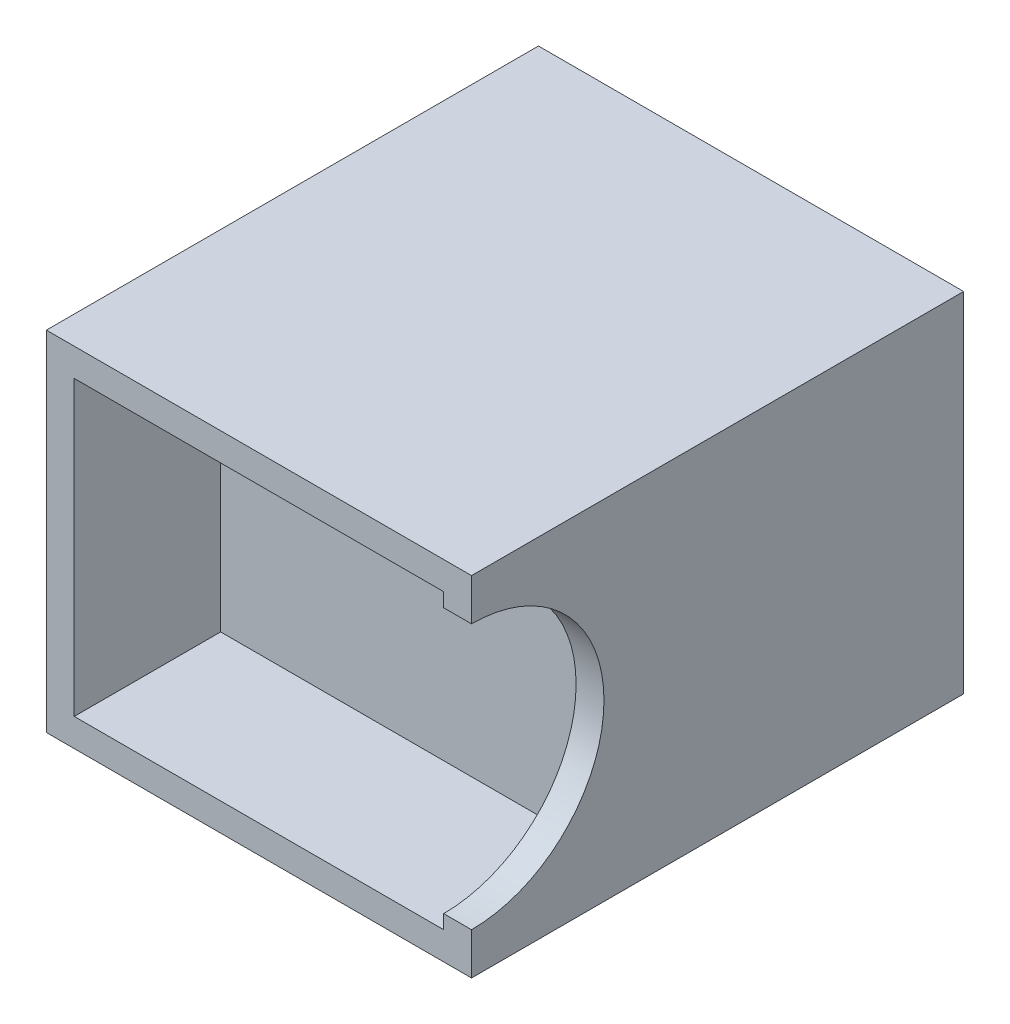
ISO-10303-21;
HEADER;
FILE_DESCRIPTION(('STEP AP214'),'2;1');
FILE_NAME('part.step','',(''),(''),'','','');
FILE_SCHEMA(('AUTOMOTIVE_DESIGN { 1 0 10303 214 1 1 1 1 }'));
ENDSEC;
DATA;
#1=APPLICATION_CONTEXT('core data for automotive mechanical design processes');
#2=APPLICATION_PROTOCOL_DEFINITION('international standard','automotive_design',2000,#1);
#3=PRODUCT_CONTEXT('',#1,'mechanical');
#4=PRODUCT('Part','Part','',(#3));
#5=PRODUCT_RELATED_PRODUCT_CATEGORY('part','',(#4));
#6=PRODUCT_DEFINITION_FORMATION('','',#4);
#7=PRODUCT_DEFINITION_CONTEXT('part definition',#1,'design');
#8=PRODUCT_DEFINITION('design','',#6,#7);
#9=PRODUCT_DEFINITION_SHAPE('','',#8);
#10=(LENGTH_UNIT() NAMED_UNIT(*) SI_UNIT(.MILLI.,.METRE.));
#11=(NAMED_UNIT(*) PLANE_ANGLE_UNIT() SI_UNIT($,.RADIAN.));
#12=(NAMED_UNIT(*) SI_UNIT($,.STERADIAN.) SOLID_ANGLE_UNIT());
#13=UNCERTAINTY_MEASURE_WITH_UNIT(LENGTH_MEASURE(1.E-05),#10,'distance_accuracy_value','');
#14=(GEOMETRIC_REPRESENTATION_CONTEXT(3) GLOBAL_UNCERTAINTY_ASSIGNED_CONTEXT((#13)) GLOBAL_UNIT_ASSIGNED_CONTEXT((#10,
#11,#12)) REPRESENTATION_CONTEXT('',''));
#15=CARTESIAN_POINT('',(0.,0.,0.));
#16=DIRECTION('',(0.,0.,1.));
#17=DIRECTION('',(1.,0.,0.));
#18=AXIS2_PLACEMENT_3D('',#15,#16,#17);
#19=CARTESIAN_POINT('',(4.,46.,70.6));
#20=DIRECTION('',(1.,0.,0.));
#21=DIRECTION('',(0.,1.,0.));
#22=AXIS2_PLACEMENT_3D('',#19,#20,#21);
#23=PLANE('',#22);
#24=DIRECTION('',(0.,0.,-1.));
#25=VECTOR('',#24,1.);
#26=CARTESIAN_POINT('',(4.00000000000001,4.,70.6));
#27=LINE('',#26,#25);
#28=CARTESIAN_POINT('',(4.00000000000001,4.,70.6));
#29=VERTEX_POINT('',#28);
#30=CARTESIAN_POINT('',(4.00000000000001,4.,49.6));
#31=VERTEX_POINT('',#30);
#32=EDGE_CURVE('E141',#29,#31,#27,.T.);
#33=ORIENTED_EDGE('',*,*,#32,.T.);
#34=DIRECTION('',(0.,1.,0.));
#35=VECTOR('',#34,1.);
#36=CARTESIAN_POINT('',(4.,46.,49.6));
#37=LINE('',#36,#35);
#38=CARTESIAN_POINT('',(4.,46.,49.6));
#39=VERTEX_POINT('',#38);
#40=EDGE_CURVE('E200',#31,#39,#37,.T.);
#41=ORIENTED_EDGE('',*,*,#40,.T.);
#42=DIRECTION('',(0.,0.,-1.));
#43=VECTOR('',#42,1.);
#44=CARTESIAN_POINT('',(4.,46.,70.6));
#45=LINE('',#44,#43);
#46=CARTESIAN_POINT('',(4.,46.,70.6));
#47=VERTEX_POINT('',#46);
#48=EDGE_CURVE('E161',#47,#39,#45,.T.);
#49=ORIENTED_EDGE('',*,*,#48,.F.);
#50=DIRECTION('',(0.,-1.,0.));
#51=VECTOR('',#50,1.);
#52=CARTESIAN_POINT('',(4.,46.,70.6));
#53=LINE('',#52,#51);
#54=EDGE_CURVE('E198',#47,#29,#53,.T.);
#55=ORIENTED_EDGE('',*,*,#54,.T.);
#56=EDGE_LOOP('',(#33,#41,#49,#55));
#57=FACE_BOUND('',#56,.T.);
#58=ADVANCED_FACE('F33',(#57),#23,.T.);
#59=CARTESIAN_POINT('',(4.00000000000001,4.,70.6));
#60=DIRECTION('',(0.,1.,0.));
#61=DIRECTION('',(0.,0.,1.));
#62=AXIS2_PLACEMENT_3D('',#59,#60,#61);
#63=PLANE('',#62);
#64=DIRECTION('',(0.,0.,-1.));
#65=VECTOR('',#64,1.);
#66=CARTESIAN_POINT('',(57.,4.,70.6));
#67=LINE('',#66,#65);
#68=CARTESIAN_POINT('',(57.,4.,70.6));
#69=VERTEX_POINT('',#68);
#70=CARTESIAN_POINT('',(57.,4.,49.6));
#71=VERTEX_POINT('',#70);
#72=EDGE_CURVE('E167',#69,#71,#67,.T.);
#73=ORIENTED_EDGE('',*,*,#72,.T.);
#74=DIRECTION('',(-1.,0.,0.));
#75=VECTOR('',#74,1.);
#76=CARTESIAN_POINT('',(4.00000000000001,4.,49.6));
#77=LINE('',#76,#75);
#78=EDGE_CURVE('E202',#71,#31,#77,.T.);
#79=ORIENTED_EDGE('',*,*,#78,.T.);
#80=ORIENTED_EDGE('',*,*,#32,.F.);
#81=DIRECTION('',(1.,0.,0.));
#82=VECTOR('',#81,1.);
#83=CARTESIAN_POINT('',(4.00000000000001,4.,70.6));
#84=LINE('',#83,#82);
#85=EDGE_CURVE('E195',#29,#69,#84,.T.);
#86=ORIENTED_EDGE('',*,*,#85,.T.);
#87=EDGE_LOOP('',(#73,#79,#80,#86));
#88=FACE_BOUND('',#87,.T.);
#89=ADVANCED_FACE('F208',(#88),#63,.T.);
#90=CARTESIAN_POINT('',(57.,46.,70.6));
#91=DIRECTION('',(-1.,0.,0.));
#92=DIRECTION('',(0.,-1.,0.));
#93=AXIS2_PLACEMENT_3D('',#90,#91,#92);
#94=PLANE('',#93);
#95=CARTESIAN_POINT('',(57.,25.,70.6));
#96=DIRECTION('',(-1.,0.,0.));
#97=DIRECTION('',(0.,-1.,0.));
#98=AXIS2_PLACEMENT_3D('',#95,#96,#97);
#99=CIRCLE('',#98,19.);
#100=CARTESIAN_POINT('',(57.,44.,70.6));
#101=VERTEX_POINT('',#100);
#102=CARTESIAN_POINT('',(57.,6.,70.6));
#103=VERTEX_POINT('',#102);
#104=EDGE_CURVE('E121',#101,#103,#99,.T.);
#105=ORIENTED_EDGE('',*,*,#104,.F.);
#106=DIRECTION('',(0.,1.,0.));
#107=VECTOR('',#106,1.);
#108=CARTESIAN_POINT('',(57.,46.,70.6));
#109=LINE('',#108,#107);
#110=CARTESIAN_POINT('',(57.,46.,70.6));
#111=VERTEX_POINT('',#110);
#112=EDGE_CURVE('E120',#101,#111,#109,.T.);
#113=ORIENTED_EDGE('',*,*,#112,.T.);
#114=DIRECTION('',(0.,0.,-1.));
#115=VECTOR('',#114,1.);
#116=CARTESIAN_POINT('',(57.,46.,70.6));
#117=LINE('',#116,#115);
#118=CARTESIAN_POINT('',(57.,46.,49.6));
#119=VERTEX_POINT('',#118);
#120=EDGE_CURVE('E159',#111,#119,#117,.T.);
#121=ORIENTED_EDGE('',*,*,#120,.T.);
#122=DIRECTION('',(0.,-1.,0.));
#123=VECTOR('',#122,1.);
#124=CARTESIAN_POINT('',(57.,46.,49.6));
#125=LINE('',#124,#123);
#126=EDGE_CURVE('E55',#119,#71,#125,.T.);
#127=ORIENTED_EDGE('',*,*,#126,.T.);
#128=ORIENTED_EDGE('',*,*,#72,.F.);
#129=EDGE_CURVE('E192',#69,#103,#109,.T.);
#130=ORIENTED_EDGE('',*,*,#129,.T.);
#131=EDGE_LOOP('',(#105,#113,#121,#127,#128,#130));
#132=FACE_BOUND('',#131,.T.);
#133=ADVANCED_FACE('F164',(#132),#94,.T.);
#134=CARTESIAN_POINT('',(4.,46.,70.6));
#135=DIRECTION('',(0.,-1.,0.));
#136=DIRECTION('',(0.,0.,-1.));
#137=AXIS2_PLACEMENT_3D('',#134,#135,#136);
#138=PLANE('',#137);
#139=ORIENTED_EDGE('',*,*,#48,.T.);
#140=DIRECTION('',(1.,0.,0.));
#141=VECTOR('',#140,1.);
#142=CARTESIAN_POINT('',(4.,46.,49.6));
#143=LINE('',#142,#141);
#144=EDGE_CURVE('E41',#39,#119,#143,.T.);
#145=ORIENTED_EDGE('',*,*,#144,.T.);
#146=ORIENTED_EDGE('',*,*,#120,.F.);
#147=DIRECTION('',(-1.,0.,0.));
#148=VECTOR('',#147,1.);
#149=CARTESIAN_POINT('',(4.,46.,70.6));
#150=LINE('',#149,#148);
#151=EDGE_CURVE('E170',#111,#47,#150,.T.);
#152=ORIENTED_EDGE('',*,*,#151,.T.);
#153=EDGE_LOOP('',(#139,#145,#146,#152));
#154=FACE_BOUND('',#153,.T.);
#155=ADVANCED_FACE('F158',(#154),#138,.T.);
#156=CARTESIAN_POINT('',(0.,0.,70.6));
#157=DIRECTION('',(0.,0.,-1.));
#158=DIRECTION('',(-1.,0.,0.));
#159=AXIS2_PLACEMENT_3D('',#156,#157,#158);
#160=PLANE('',#159);
#161=ORIENTED_EDGE('',*,*,#112,.F.);
#162=DIRECTION('',(1.,0.,0.));
#163=VECTOR('',#162,1.);
#164=CARTESIAN_POINT('',(51.,44.,70.6));
#165=LINE('',#164,#163);
#166=CARTESIAN_POINT('',(61.,44.,70.6));
#167=VERTEX_POINT('',#166);
#168=EDGE_CURVE('E108',#101,#167,#165,.T.);
#169=ORIENTED_EDGE('',*,*,#168,.T.);
#170=DIRECTION('',(0.,1.,0.));
#171=VECTOR('',#170,1.);
#172=CARTESIAN_POINT('',(61.,0.,70.6));
#173=LINE('',#172,#171);
#174=CARTESIAN_POINT('',(61.,50.,70.6));
#175=VERTEX_POINT('',#174);
#176=EDGE_CURVE('E117',#167,#175,#173,.T.);
#177=ORIENTED_EDGE('',*,*,#176,.T.);
#178=DIRECTION('',(-1.,0.,0.));
#179=VECTOR('',#178,1.);
#180=CARTESIAN_POINT('',(0.,50.,70.6));
#181=LINE('',#180,#179);
#182=CARTESIAN_POINT('',(0.,50.,70.6));
#183=VERTEX_POINT('',#182);
#184=EDGE_CURVE('E130',#175,#183,#181,.T.);
#185=ORIENTED_EDGE('',*,*,#184,.T.);
#186=DIRECTION('',(0.,-1.,0.));
#187=VECTOR('',#186,1.);
#188=CARTESIAN_POINT('',(0.,0.,70.6));
#189=LINE('',#188,#187);
#190=CARTESIAN_POINT('',(0.,0.,70.6));
#191=VERTEX_POINT('',#190);
#192=EDGE_CURVE('E131',#183,#191,#189,.T.);
#193=ORIENTED_EDGE('',*,*,#192,.T.);
#194=DIRECTION('',(1.,0.,0.));
#195=VECTOR('',#194,1.);
#196=CARTESIAN_POINT('',(0.,0.,70.6));
#197=LINE('',#196,#195);
#198=CARTESIAN_POINT('',(61.,0.,70.6));
#199=VERTEX_POINT('',#198);
#200=EDGE_CURVE('E128',#191,#199,#197,.T.);
#201=ORIENTED_EDGE('',*,*,#200,.T.);
#202=CARTESIAN_POINT('',(61.,6.,70.6));
#203=VERTEX_POINT('',#202);
#204=EDGE_CURVE('E127',#199,#203,#173,.T.);
#205=ORIENTED_EDGE('',*,*,#204,.T.);
#206=DIRECTION('',(1.,0.,0.));
#207=VECTOR('',#206,1.);
#208=CARTESIAN_POINT('',(51.,6.,70.6));
#209=LINE('',#208,#207);
#210=EDGE_CURVE('E48',#203,#103,#209,.F.);
#211=ORIENTED_EDGE('',*,*,#210,.T.);
#212=ORIENTED_EDGE('',*,*,#129,.F.);
#213=ORIENTED_EDGE('',*,*,#85,.F.);
#214=ORIENTED_EDGE('',*,*,#54,.F.);
#215=ORIENTED_EDGE('',*,*,#151,.F.);
#216=EDGE_LOOP('',(#161,#169,#177,#185,#193,#201,#205,#211,#212,#213,#214,#215));
#217=FACE_BOUND('',#216,.T.);
#218=ADVANCED_FACE('F116',(#217),#160,.F.);
#219=CARTESIAN_POINT('',(0.,0.,0.));
#220=DIRECTION('',(0.,0.,-1.));
#221=DIRECTION('',(-1.,0.,0.));
#222=AXIS2_PLACEMENT_3D('',#219,#220,#221);
#223=PLANE('',#222);
#224=DIRECTION('',(0.,-1.,0.));
#225=VECTOR('',#224,1.);
#226=CARTESIAN_POINT('',(0.,0.,0.));
#227=LINE('',#226,#225);
#228=CARTESIAN_POINT('',(0.,50.,0.));
#229=VERTEX_POINT('',#228);
#230=CARTESIAN_POINT('',(0.,0.,0.));
#231=VERTEX_POINT('',#230);
#232=EDGE_CURVE('E137',#229,#231,#227,.T.);
#233=ORIENTED_EDGE('',*,*,#232,.F.);
#234=DIRECTION('',(-1.,0.,0.));
#235=VECTOR('',#234,1.);
#236=CARTESIAN_POINT('',(0.,50.,0.));
#237=LINE('',#236,#235);
#238=CARTESIAN_POINT('',(61.,50.,0.));
#239=VERTEX_POINT('',#238);
#240=EDGE_CURVE('E146',#239,#229,#237,.T.);
#241=ORIENTED_EDGE('',*,*,#240,.F.);
#242=DIRECTION('',(0.,1.,0.));
#243=VECTOR('',#242,1.);
#244=CARTESIAN_POINT('',(61.,0.,0.));
#245=LINE('',#244,#243);
#246=CARTESIAN_POINT('',(61.,0.,0.));
#247=VERTEX_POINT('',#246);
#248=EDGE_CURVE('E144',#247,#239,#245,.T.);
#249=ORIENTED_EDGE('',*,*,#248,.F.);
#250=DIRECTION('',(1.,0.,0.));
#251=VECTOR('',#250,1.);
#252=CARTESIAN_POINT('',(0.,0.,0.));
#253=LINE('',#252,#251);
#254=EDGE_CURVE('E140',#231,#247,#253,.T.);
#255=ORIENTED_EDGE('',*,*,#254,.F.);
#256=EDGE_LOOP('',(#233,#241,#249,#255));
#257=FACE_BOUND('',#256,.T.);
#258=ADVANCED_FACE('F187',(#257),#223,.T.);
#259=CARTESIAN_POINT('',(0.,0.,70.6));
#260=DIRECTION('',(1.,0.,0.));
#261=DIRECTION('',(0.,0.,-1.));
#262=AXIS2_PLACEMENT_3D('',#259,#260,#261);
#263=PLANE('',#262);
#264=ORIENTED_EDGE('',*,*,#232,.T.);
#265=DIRECTION('',(0.,0.,-1.));
#266=VECTOR('',#265,1.);
#267=CARTESIAN_POINT('',(0.,0.,70.6));
#268=LINE('',#267,#266);
#269=EDGE_CURVE('E153',#191,#231,#268,.T.);
#270=ORIENTED_EDGE('',*,*,#269,.F.);
#271=ORIENTED_EDGE('',*,*,#192,.F.);
#272=DIRECTION('',(0.,0.,-1.));
#273=VECTOR('',#272,1.);
#274=CARTESIAN_POINT('',(0.,50.,70.6));
#275=LINE('',#274,#273);
#276=EDGE_CURVE('E136',#183,#229,#275,.T.);
#277=ORIENTED_EDGE('',*,*,#276,.T.);
#278=EDGE_LOOP('',(#264,#270,#271,#277));
#279=FACE_BOUND('',#278,.T.);
#280=ADVANCED_FACE('F35',(#279),#263,.F.);
#281=CARTESIAN_POINT('',(0.,0.,70.6));
#282=DIRECTION('',(0.,1.,0.));
#283=DIRECTION('',(0.,0.,1.));
#284=AXIS2_PLACEMENT_3D('',#281,#282,#283);
#285=PLANE('',#284);
#286=ORIENTED_EDGE('',*,*,#254,.T.);
#287=DIRECTION('',(0.,0.,-1.));
#288=VECTOR('',#287,1.);
#289=CARTESIAN_POINT('',(61.,0.,70.6));
#290=LINE('',#289,#288);
#291=EDGE_CURVE('E151',#199,#247,#290,.T.);
#292=ORIENTED_EDGE('',*,*,#291,.F.);
#293=ORIENTED_EDGE('',*,*,#200,.F.);
#294=ORIENTED_EDGE('',*,*,#269,.T.);
#295=EDGE_LOOP('',(#286,#292,#293,#294));
#296=FACE_BOUND('',#295,.T.);
#297=ADVANCED_FACE('F184',(#296),#285,.F.);
#298=CARTESIAN_POINT('',(61.,0.,70.6));
#299=DIRECTION('',(-1.,0.,0.));
#300=DIRECTION('',(0.,0.,1.));
#301=AXIS2_PLACEMENT_3D('',#298,#299,#300);
#302=PLANE('',#301);
#303=ORIENTED_EDGE('',*,*,#176,.F.);
#304=CARTESIAN_POINT('',(61.,25.,70.6));
#305=DIRECTION('',(-1.,0.,0.));
#306=DIRECTION('',(0.,0.,1.));
#307=AXIS2_PLACEMENT_3D('',#304,#305,#306);
#308=CIRCLE('',#307,19.);
#309=EDGE_CURVE('E11',#167,#203,#308,.T.);
#310=ORIENTED_EDGE('',*,*,#309,.T.);
#311=ORIENTED_EDGE('',*,*,#204,.F.);
#312=ORIENTED_EDGE('',*,*,#291,.T.);
#313=ORIENTED_EDGE('',*,*,#248,.T.);
#314=DIRECTION('',(0.,0.,-1.));
#315=VECTOR('',#314,1.);
#316=CARTESIAN_POINT('',(61.,50.,70.6));
#317=LINE('',#316,#315);
#318=EDGE_CURVE('E125',#175,#239,#317,.T.);
#319=ORIENTED_EDGE('',*,*,#318,.F.);
#320=EDGE_LOOP('',(#303,#310,#311,#312,#313,#319));
#321=FACE_BOUND('',#320,.T.);
#322=ADVANCED_FACE('F123',(#321),#302,.F.);
#323=CARTESIAN_POINT('',(0.,50.,70.6));
#324=DIRECTION('',(0.,-1.,0.));
#325=DIRECTION('',(0.,0.,-1.));
#326=AXIS2_PLACEMENT_3D('',#323,#324,#325);
#327=PLANE('',#326);
#328=ORIENTED_EDGE('',*,*,#240,.T.);
#329=ORIENTED_EDGE('',*,*,#276,.F.);
#330=ORIENTED_EDGE('',*,*,#184,.F.);
#331=ORIENTED_EDGE('',*,*,#318,.T.);
#332=EDGE_LOOP('',(#328,#329,#330,#331));
#333=FACE_BOUND('',#332,.T.);
#334=ADVANCED_FACE('F213',(#333),#327,.F.);
#335=CARTESIAN_POINT('',(0.,0.,49.6));
#336=DIRECTION('',(0.,0.,-1.));
#337=DIRECTION('',(-1.,0.,0.));
#338=AXIS2_PLACEMENT_3D('',#335,#336,#337);
#339=PLANE('',#338);
#340=ORIENTED_EDGE('',*,*,#40,.F.);
#341=ORIENTED_EDGE('',*,*,#78,.F.);
#342=ORIENTED_EDGE('',*,*,#126,.F.);
#343=ORIENTED_EDGE('',*,*,#144,.F.);
#344=EDGE_LOOP('',(#340,#341,#342,#343));
#345=FACE_BOUND('',#344,.T.);
#346=ADVANCED_FACE('F211',(#345),#339,.F.);
#347=CARTESIAN_POINT('',(51.,25.,70.6));
#348=DIRECTION('',(1.,0.,0.));
#349=DIRECTION('',(0.,0.,-1.));
#350=AXIS2_PLACEMENT_3D('',#347,#348,#349);
#351=CYLINDRICAL_SURFACE('',#350,19.);
#352=ORIENTED_EDGE('',*,*,#104,.T.);
#353=ORIENTED_EDGE('',*,*,#210,.F.);
#354=ORIENTED_EDGE('',*,*,#309,.F.);
#355=ORIENTED_EDGE('',*,*,#168,.F.);
#356=EDGE_LOOP('',(#352,#353,#354,#355));
#357=FACE_BOUND('',#356,.T.);
#358=ADVANCED_FACE('F107',(#357),#351,.F.);
#359=CLOSED_SHELL('',(#58,#89,#133,#155,#218,#258,#280,#297,#322,#334,#346,#358));
#360=MANIFOLD_SOLID_BREP('B2',#359);
#361=ADVANCED_BREP_SHAPE_REPRESENTATION('',(#18,#360),#14);
#362=SHAPE_DEFINITION_REPRESENTATION(#9,#361);
ENDSEC;
END-ISO-10303-21;
